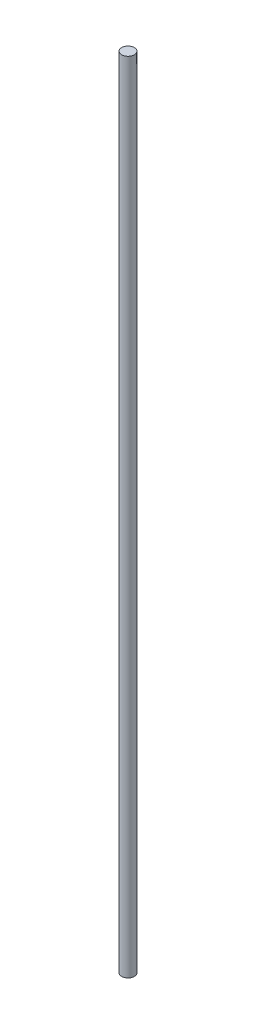
ISO-10303-21;
HEADER;
FILE_DESCRIPTION(('STEP AP214'),'2;1');
FILE_NAME('part.step','',(''),(''),'','','');
FILE_SCHEMA(('AUTOMOTIVE_DESIGN { 1 0 10303 214 1 1 1 1 }'));
ENDSEC;
DATA;
#1=APPLICATION_CONTEXT('core data for automotive mechanical design processes');
#2=APPLICATION_PROTOCOL_DEFINITION('international standard','automotive_design',2000,#1);
#3=PRODUCT_CONTEXT('',#1,'mechanical');
#4=PRODUCT('Part','Part','',(#3));
#5=PRODUCT_RELATED_PRODUCT_CATEGORY('part','',(#4));
#6=PRODUCT_DEFINITION_FORMATION('','',#4);
#7=PRODUCT_DEFINITION_CONTEXT('part definition',#1,'design');
#8=PRODUCT_DEFINITION('design','',#6,#7);
#9=PRODUCT_DEFINITION_SHAPE('','',#8);
#10=(LENGTH_UNIT() NAMED_UNIT(*) SI_UNIT(.MILLI.,.METRE.));
#11=(NAMED_UNIT(*) PLANE_ANGLE_UNIT() SI_UNIT($,.RADIAN.));
#12=(NAMED_UNIT(*) SI_UNIT($,.STERADIAN.) SOLID_ANGLE_UNIT());
#13=UNCERTAINTY_MEASURE_WITH_UNIT(LENGTH_MEASURE(1.E-05),#10,'distance_accuracy_value','');
#14=(GEOMETRIC_REPRESENTATION_CONTEXT(3) GLOBAL_UNCERTAINTY_ASSIGNED_CONTEXT((#13)) GLOBAL_UNIT_ASSIGNED_CONTEXT((#10,
#11,#12)) REPRESENTATION_CONTEXT('',''));
#15=CARTESIAN_POINT('',(0.,0.,0.));
#16=DIRECTION('',(0.,0.,1.));
#17=DIRECTION('',(1.,0.,0.));
#18=AXIS2_PLACEMENT_3D('',#15,#16,#17);
#19=CARTESIAN_POINT('',(0.,603.25,0.));
#20=DIRECTION('',(0.,-1.,0.));
#21=DIRECTION('',(0.,0.,-1.));
#22=AXIS2_PLACEMENT_3D('',#19,#20,#21);
#23=CYLINDRICAL_SURFACE('',#22,4.7625);
#24=CARTESIAN_POINT('',(0.,603.25,0.));
#25=DIRECTION('',(0.,1.,0.));
#26=DIRECTION('',(0.,0.,1.));
#27=AXIS2_PLACEMENT_3D('',#24,#25,#26);
#28=CIRCLE('',#27,4.7625);
#29=CARTESIAN_POINT('',(0.,603.25,4.7625));
#30=VERTEX_POINT('',#29);
#31=EDGE_CURVE('E10',#30,#30,#28,.T.);
#32=ORIENTED_EDGE('',*,*,#31,.F.);
#33=EDGE_LOOP('',(#32));
#34=FACE_BOUND('',#33,.T.);
#35=CARTESIAN_POINT('',(0.,0.,0.));
#36=DIRECTION('',(0.,1.,0.));
#37=DIRECTION('',(0.,0.,1.));
#38=AXIS2_PLACEMENT_3D('',#35,#36,#37);
#39=CIRCLE('',#38,4.7625);
#40=CARTESIAN_POINT('',(0.,0.,4.7625));
#41=VERTEX_POINT('',#40);
#42=EDGE_CURVE('E34',#41,#41,#39,.T.);
#43=ORIENTED_EDGE('',*,*,#42,.T.);
#44=EDGE_LOOP('',(#43));
#45=FACE_BOUND('',#44,.T.);
#46=ADVANCED_FACE('F31',(#34,#45),#23,.T.);
#47=CARTESIAN_POINT('',(0.,603.25,0.));
#48=DIRECTION('',(0.,1.,0.));
#49=DIRECTION('',(0.,0.,1.));
#50=AXIS2_PLACEMENT_3D('',#47,#48,#49);
#51=PLANE('',#50);
#52=ORIENTED_EDGE('',*,*,#31,.T.);
#53=EDGE_LOOP('',(#52));
#54=FACE_BOUND('',#53,.T.);
#55=ADVANCED_FACE('F46',(#54),#51,.T.);
#56=CARTESIAN_POINT('',(0.,0.,0.));
#57=DIRECTION('',(0.,1.,0.));
#58=DIRECTION('',(0.,0.,1.));
#59=AXIS2_PLACEMENT_3D('',#56,#57,#58);
#60=PLANE('',#59);
#61=ORIENTED_EDGE('',*,*,#42,.F.);
#62=EDGE_LOOP('',(#61));
#63=FACE_BOUND('',#62,.T.);
#64=ADVANCED_FACE('F44',(#63),#60,.F.);
#65=CLOSED_SHELL('',(#46,#55,#64));
#66=MANIFOLD_SOLID_BREP('B2',#65);
#67=ADVANCED_BREP_SHAPE_REPRESENTATION('',(#18,#66),#14);
#68=SHAPE_DEFINITION_REPRESENTATION(#9,#67);
ENDSEC;
END-ISO-10303-21;
